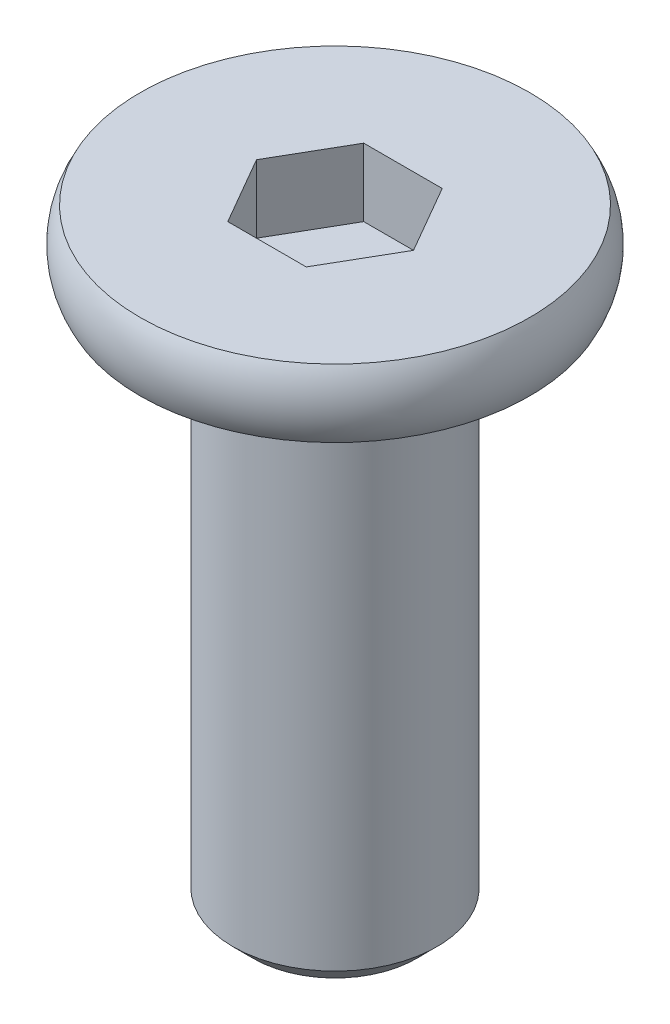
ISO-10303-21;
HEADER;
FILE_DESCRIPTION(('STEP AP214'),'2;1');
FILE_NAME('part.step','',(''),(''),'','','');
FILE_SCHEMA(('AUTOMOTIVE_DESIGN { 1 0 10303 214 1 1 1 1 }'));
ENDSEC;
DATA;
#1=APPLICATION_CONTEXT('core data for automotive mechanical design processes');
#2=APPLICATION_PROTOCOL_DEFINITION('international standard','automotive_design',2000,#1);
#3=PRODUCT_CONTEXT('',#1,'mechanical');
#4=PRODUCT('Part','Part','',(#3));
#5=PRODUCT_RELATED_PRODUCT_CATEGORY('part','',(#4));
#6=PRODUCT_DEFINITION_FORMATION('','',#4);
#7=PRODUCT_DEFINITION_CONTEXT('part definition',#1,'design');
#8=PRODUCT_DEFINITION('design','',#6,#7);
#9=PRODUCT_DEFINITION_SHAPE('','',#8);
#10=(LENGTH_UNIT() NAMED_UNIT(*) SI_UNIT(.MILLI.,.METRE.));
#11=(NAMED_UNIT(*) PLANE_ANGLE_UNIT() SI_UNIT($,.RADIAN.));
#12=(NAMED_UNIT(*) SI_UNIT($,.STERADIAN.) SOLID_ANGLE_UNIT());
#13=UNCERTAINTY_MEASURE_WITH_UNIT(LENGTH_MEASURE(1.E-05),#10,'distance_accuracy_value','');
#14=(GEOMETRIC_REPRESENTATION_CONTEXT(3) GLOBAL_UNCERTAINTY_ASSIGNED_CONTEXT((#13)) GLOBAL_UNIT_ASSIGNED_CONTEXT((#10,
#11,#12)) REPRESENTATION_CONTEXT('',''));
#15=CARTESIAN_POINT('',(0.,0.,0.));
#16=DIRECTION('',(0.,0.,1.));
#17=DIRECTION('',(1.,0.,0.));
#18=AXIS2_PLACEMENT_3D('',#15,#16,#17);
#19=CARTESIAN_POINT('',(1.5,-9.,0.));
#20=DIRECTION('',(0.,1.,0.));
#21=DIRECTION('',(0.,0.,1.));
#22=AXIS2_PLACEMENT_3D('',#19,#20,#21);
#23=PLANE('',#22);
#24=CARTESIAN_POINT('',(0.,-9.,0.));
#25=DIRECTION('',(0.,1.,0.));
#26=DIRECTION('',(0.,0.,1.));
#27=AXIS2_PLACEMENT_3D('',#24,#25,#26);
#28=CIRCLE('',#27,1.2);
#29=CARTESIAN_POINT('',(0.,-9.,1.2));
#30=VERTEX_POINT('',#29);
#31=EDGE_CURVE('E11',#30,#30,#28,.F.);
#32=ORIENTED_EDGE('',*,*,#31,.T.);
#33=EDGE_LOOP('',(#32));
#34=FACE_BOUND('',#33,.T.);
#35=ADVANCED_FACE('F37',(#34),#23,.F.);
#36=CARTESIAN_POINT('',(0.,0.,0.));
#37=DIRECTION('',(0.,1.,0.));
#38=DIRECTION('',(0.,0.,1.));
#39=AXIS2_PLACEMENT_3D('',#36,#37,#38);
#40=CYLINDRICAL_SURFACE('',#39,1.5);
#41=CARTESIAN_POINT('',(0.,-8.7,0.));
#42=DIRECTION('',(0.,1.,0.));
#43=DIRECTION('',(0.,0.,1.));
#44=AXIS2_PLACEMENT_3D('',#41,#42,#43);
#45=CIRCLE('',#44,1.5);
#46=CARTESIAN_POINT('',(0.,-8.7,1.5));
#47=VERTEX_POINT('',#46);
#48=EDGE_CURVE('E45',#47,#47,#45,.T.);
#49=ORIENTED_EDGE('',*,*,#48,.T.);
#50=EDGE_LOOP('',(#49));
#51=FACE_BOUND('',#50,.T.);
#52=CARTESIAN_POINT('',(0.,-1.,0.));
#53=DIRECTION('',(0.,1.,0.));
#54=DIRECTION('',(0.,0.,1.));
#55=AXIS2_PLACEMENT_3D('',#52,#53,#54);
#56=CIRCLE('',#55,1.5);
#57=CARTESIAN_POINT('',(0.,-1.,1.5));
#58=VERTEX_POINT('',#57);
#59=EDGE_CURVE('E150',#58,#58,#56,.T.);
#60=ORIENTED_EDGE('',*,*,#59,.F.);
#61=EDGE_LOOP('',(#60));
#62=FACE_BOUND('',#61,.T.);
#63=ADVANCED_FACE('F155',(#51,#62),#40,.T.);
#64=CARTESIAN_POINT('',(2.86602540378444,-1.,0.));
#65=DIRECTION('',(0.,1.,0.));
#66=DIRECTION('',(0.,0.,1.));
#67=AXIS2_PLACEMENT_3D('',#64,#65,#66);
#68=PLANE('',#67);
#69=CARTESIAN_POINT('',(0.,-1.,0.));
#70=DIRECTION('',(0.,1.,0.));
#71=DIRECTION('',(0.,0.,1.));
#72=AXIS2_PLACEMENT_3D('',#69,#70,#71);
#73=CIRCLE('',#72,2.86602540378444);
#74=CARTESIAN_POINT('',(0.,-1.,2.86602540378444));
#75=VERTEX_POINT('',#74);
#76=EDGE_CURVE('E147',#75,#75,#73,.T.);
#77=ORIENTED_EDGE('',*,*,#76,.F.);
#78=EDGE_LOOP('',(#77));
#79=FACE_BOUND('',#78,.T.);
#80=ORIENTED_EDGE('',*,*,#59,.T.);
#81=EDGE_LOOP('',(#80));
#82=FACE_BOUND('',#81,.T.);
#83=ADVANCED_FACE('F177',(#79,#82),#68,.F.);
#84=CARTESIAN_POINT('',(0.,-0.5,0.));
#85=DIRECTION('',(0.,1.,0.));
#86=DIRECTION('',(0.,0.,1.));
#87=AXIS2_PLACEMENT_3D('',#84,#85,#86);
#88=TOROIDAL_SURFACE('',#87,2.,1.);
#89=CARTESIAN_POINT('',(0.,0.,0.));
#90=DIRECTION('',(0.,1.,0.));
#91=DIRECTION('',(0.,0.,1.));
#92=AXIS2_PLACEMENT_3D('',#89,#90,#91);
#93=CIRCLE('',#92,2.86602540378444);
#94=CARTESIAN_POINT('',(0.,0.,2.86602540378444));
#95=VERTEX_POINT('',#94);
#96=EDGE_CURVE('E139',#95,#95,#93,.T.);
#97=ORIENTED_EDGE('',*,*,#96,.F.);
#98=EDGE_LOOP('',(#97));
#99=FACE_BOUND('',#98,.T.);
#100=ORIENTED_EDGE('',*,*,#76,.T.);
#101=EDGE_LOOP('',(#100));
#102=FACE_BOUND('',#101,.T.);
#103=ADVANCED_FACE('F168',(#99,#102),#88,.T.);
#104=CARTESIAN_POINT('',(0.,0.,0.));
#105=DIRECTION('',(0.,-1.,0.));
#106=DIRECTION('',(0.,0.,-1.));
#107=AXIS2_PLACEMENT_3D('',#104,#105,#106);
#108=PLANE('',#107);
#109=DIRECTION('',(-0.5,0.,-0.866025403784438));
#110=VECTOR('',#109,1.);
#111=CARTESIAN_POINT('',(1.15470053837925,0.,0.));
#112=LINE('',#111,#110);
#113=CARTESIAN_POINT('',(1.15470053837925,0.,0.));
#114=VERTEX_POINT('',#113);
#115=CARTESIAN_POINT('',(0.577350269189626,0.,-1.));
#116=VERTEX_POINT('',#115);
#117=EDGE_CURVE('E126',#114,#116,#112,.T.);
#118=ORIENTED_EDGE('',*,*,#117,.F.);
#119=DIRECTION('',(0.5,0.,-0.866025403784439));
#120=VECTOR('',#119,1.);
#121=CARTESIAN_POINT('',(0.577350269189626,0.,1.));
#122=LINE('',#121,#120);
#123=CARTESIAN_POINT('',(0.577350269189626,0.,1.));
#124=VERTEX_POINT('',#123);
#125=EDGE_CURVE('E52',#124,#114,#122,.T.);
#126=ORIENTED_EDGE('',*,*,#125,.F.);
#127=DIRECTION('',(1.,0.,0.));
#128=VECTOR('',#127,1.);
#129=CARTESIAN_POINT('',(-0.577350269189625,0.,1.));
#130=LINE('',#129,#128);
#131=CARTESIAN_POINT('',(-0.577350269189625,0.,1.));
#132=VERTEX_POINT('',#131);
#133=EDGE_CURVE('E135',#132,#124,#130,.T.);
#134=ORIENTED_EDGE('',*,*,#133,.F.);
#135=DIRECTION('',(0.5,0.,0.866025403784439));
#136=VECTOR('',#135,1.);
#137=CARTESIAN_POINT('',(-1.15470053837925,0.,0.));
#138=LINE('',#137,#136);
#139=CARTESIAN_POINT('',(-1.15470053837925,0.,0.));
#140=VERTEX_POINT('',#139);
#141=EDGE_CURVE('E133',#140,#132,#138,.T.);
#142=ORIENTED_EDGE('',*,*,#141,.F.);
#143=DIRECTION('',(-0.5,0.,0.866025403784438));
#144=VECTOR('',#143,1.);
#145=CARTESIAN_POINT('',(-0.577350269189626,0.,-1.));
#146=LINE('',#145,#144);
#147=CARTESIAN_POINT('',(-0.577350269189626,0.,-1.));
#148=VERTEX_POINT('',#147);
#149=EDGE_CURVE('E100',#148,#140,#146,.T.);
#150=ORIENTED_EDGE('',*,*,#149,.F.);
#151=DIRECTION('',(-1.,0.,0.));
#152=VECTOR('',#151,1.);
#153=CARTESIAN_POINT('',(0.577350269189626,0.,-1.));
#154=LINE('',#153,#152);
#155=EDGE_CURVE('E129',#116,#148,#154,.T.);
#156=ORIENTED_EDGE('',*,*,#155,.F.);
#157=EDGE_LOOP('',(#118,#126,#134,#142,#150,#156));
#158=FACE_BOUND('',#157,.T.);
#159=ORIENTED_EDGE('',*,*,#96,.T.);
#160=EDGE_LOOP('',(#159));
#161=FACE_BOUND('',#160,.T.);
#162=ADVANCED_FACE('F160',(#158,#161),#108,.F.);
#163=CARTESIAN_POINT('',(0.,-8.7,0.));
#164=DIRECTION('',(0.,1.,0.));
#165=DIRECTION('',(0.,0.,1.));
#166=AXIS2_PLACEMENT_3D('',#163,#164,#165);
#167=CONICAL_SURFACE('',#166,1.5,0.785398163397456);
#168=ORIENTED_EDGE('',*,*,#31,.F.);
#169=EDGE_LOOP('',(#168));
#170=FACE_BOUND('',#169,.T.);
#171=ORIENTED_EDGE('',*,*,#48,.F.);
#172=EDGE_LOOP('',(#171));
#173=FACE_BOUND('',#172,.T.);
#174=ADVANCED_FACE('F39',(#170,#173),#167,.T.);
#175=CARTESIAN_POINT('',(0.577350269189626,-1.,1.));
#176=DIRECTION('',(0.866025403784439,0.,0.5));
#177=DIRECTION('',(0.5,0.,-0.866025403784439));
#178=AXIS2_PLACEMENT_3D('',#175,#176,#177);
#179=PLANE('',#178);
#180=ORIENTED_EDGE('',*,*,#125,.T.);
#181=DIRECTION('',(0.,1.,0.));
#182=VECTOR('',#181,1.);
#183=CARTESIAN_POINT('',(1.15470053837925,-1.,0.));
#184=LINE('',#183,#182);
#185=CARTESIAN_POINT('',(1.15470053837925,-1.,0.));
#186=VERTEX_POINT('',#185);
#187=EDGE_CURVE('E82',#186,#114,#184,.T.);
#188=ORIENTED_EDGE('',*,*,#187,.F.);
#189=DIRECTION('',(0.5,0.,-0.866025403784439));
#190=VECTOR('',#189,1.);
#191=CARTESIAN_POINT('',(0.577350269189626,-1.,1.));
#192=LINE('',#191,#190);
#193=CARTESIAN_POINT('',(0.577350269189626,-1.,1.));
#194=VERTEX_POINT('',#193);
#195=EDGE_CURVE('E137',#194,#186,#192,.T.);
#196=ORIENTED_EDGE('',*,*,#195,.F.);
#197=DIRECTION('',(0.,1.,0.));
#198=VECTOR('',#197,1.);
#199=CARTESIAN_POINT('',(0.577350269189626,-1.,1.));
#200=LINE('',#199,#198);
#201=EDGE_CURVE('E60',#194,#124,#200,.T.);
#202=ORIENTED_EDGE('',*,*,#201,.T.);
#203=EDGE_LOOP('',(#180,#188,#196,#202));
#204=FACE_BOUND('',#203,.T.);
#205=ADVANCED_FACE('F159',(#204),#179,.F.);
#206=CARTESIAN_POINT('',(-0.577350269189625,-1.,1.));
#207=DIRECTION('',(0.,0.,1.));
#208=DIRECTION('',(1.,0.,0.));
#209=AXIS2_PLACEMENT_3D('',#206,#207,#208);
#210=PLANE('',#209);
#211=ORIENTED_EDGE('',*,*,#133,.T.);
#212=ORIENTED_EDGE('',*,*,#201,.F.);
#213=DIRECTION('',(1.,0.,0.));
#214=VECTOR('',#213,1.);
#215=CARTESIAN_POINT('',(-0.577350269189625,-1.,1.));
#216=LINE('',#215,#214);
#217=CARTESIAN_POINT('',(-0.577350269189625,-1.,1.));
#218=VERTEX_POINT('',#217);
#219=EDGE_CURVE('E112',#218,#194,#216,.T.);
#220=ORIENTED_EDGE('',*,*,#219,.F.);
#221=DIRECTION('',(0.,1.,0.));
#222=VECTOR('',#221,1.);
#223=CARTESIAN_POINT('',(-0.577350269189625,-1.,1.));
#224=LINE('',#223,#222);
#225=EDGE_CURVE('E104',#218,#132,#224,.T.);
#226=ORIENTED_EDGE('',*,*,#225,.T.);
#227=EDGE_LOOP('',(#211,#212,#220,#226));
#228=FACE_BOUND('',#227,.T.);
#229=ADVANCED_FACE('F166',(#228),#210,.F.);
#230=CARTESIAN_POINT('',(-1.15470053837925,-1.,0.));
#231=DIRECTION('',(-0.866025403784439,0.,0.5));
#232=DIRECTION('',(0.5,0.,0.866025403784439));
#233=AXIS2_PLACEMENT_3D('',#230,#231,#232);
#234=PLANE('',#233);
#235=ORIENTED_EDGE('',*,*,#141,.T.);
#236=ORIENTED_EDGE('',*,*,#225,.F.);
#237=DIRECTION('',(0.5,0.,0.866025403784439));
#238=VECTOR('',#237,1.);
#239=CARTESIAN_POINT('',(-1.15470053837925,-1.,0.));
#240=LINE('',#239,#238);
#241=CARTESIAN_POINT('',(-1.15470053837925,-1.,0.));
#242=VERTEX_POINT('',#241);
#243=EDGE_CURVE('E108',#242,#218,#240,.T.);
#244=ORIENTED_EDGE('',*,*,#243,.F.);
#245=DIRECTION('',(0.,1.,0.));
#246=VECTOR('',#245,1.);
#247=CARTESIAN_POINT('',(-1.15470053837925,-1.,0.));
#248=LINE('',#247,#246);
#249=EDGE_CURVE('E93',#242,#140,#248,.T.);
#250=ORIENTED_EDGE('',*,*,#249,.T.);
#251=EDGE_LOOP('',(#235,#236,#244,#250));
#252=FACE_BOUND('',#251,.T.);
#253=ADVANCED_FACE('F109',(#252),#234,.F.);
#254=CARTESIAN_POINT('',(-0.577350269189626,-1.,-1.));
#255=DIRECTION('',(-0.866025403784439,0.,-0.5));
#256=DIRECTION('',(-0.5,0.,0.866025403784439));
#257=AXIS2_PLACEMENT_3D('',#254,#255,#256);
#258=PLANE('',#257);
#259=ORIENTED_EDGE('',*,*,#149,.T.);
#260=ORIENTED_EDGE('',*,*,#249,.F.);
#261=DIRECTION('',(-0.5,0.,0.866025403784438));
#262=VECTOR('',#261,1.);
#263=CARTESIAN_POINT('',(-0.577350269189626,-1.,-1.));
#264=LINE('',#263,#262);
#265=CARTESIAN_POINT('',(-0.577350269189626,-1.,-1.));
#266=VERTEX_POINT('',#265);
#267=EDGE_CURVE('E97',#266,#242,#264,.T.);
#268=ORIENTED_EDGE('',*,*,#267,.F.);
#269=DIRECTION('',(0.,1.,0.));
#270=VECTOR('',#269,1.);
#271=CARTESIAN_POINT('',(-0.577350269189626,-1.,-1.));
#272=LINE('',#271,#270);
#273=EDGE_CURVE('E105',#266,#148,#272,.T.);
#274=ORIENTED_EDGE('',*,*,#273,.T.);
#275=EDGE_LOOP('',(#259,#260,#268,#274));
#276=FACE_BOUND('',#275,.T.);
#277=ADVANCED_FACE('F95',(#276),#258,.F.);
#278=CARTESIAN_POINT('',(0.577350269189626,-1.,-1.));
#279=DIRECTION('',(0.,0.,-1.));
#280=DIRECTION('',(-1.,0.,0.));
#281=AXIS2_PLACEMENT_3D('',#278,#279,#280);
#282=PLANE('',#281);
#283=ORIENTED_EDGE('',*,*,#155,.T.);
#284=ORIENTED_EDGE('',*,*,#273,.F.);
#285=DIRECTION('',(-1.,0.,0.));
#286=VECTOR('',#285,1.);
#287=CARTESIAN_POINT('',(0.577350269189626,-1.,-1.));
#288=LINE('',#287,#286);
#289=CARTESIAN_POINT('',(0.577350269189626,-1.,-1.));
#290=VERTEX_POINT('',#289);
#291=EDGE_CURVE('E118',#290,#266,#288,.T.);
#292=ORIENTED_EDGE('',*,*,#291,.F.);
#293=DIRECTION('',(0.,1.,0.));
#294=VECTOR('',#293,1.);
#295=CARTESIAN_POINT('',(0.577350269189626,-1.,-1.));
#296=LINE('',#295,#294);
#297=EDGE_CURVE('E142',#290,#116,#296,.T.);
#298=ORIENTED_EDGE('',*,*,#297,.T.);
#299=EDGE_LOOP('',(#283,#284,#292,#298));
#300=FACE_BOUND('',#299,.T.);
#301=ADVANCED_FACE('F189',(#300),#282,.F.);
#302=CARTESIAN_POINT('',(1.15470053837925,-1.,0.));
#303=DIRECTION('',(0.866025403784438,0.,-0.5));
#304=DIRECTION('',(-0.5,0.,-0.866025403784439));
#305=AXIS2_PLACEMENT_3D('',#302,#303,#304);
#306=PLANE('',#305);
#307=ORIENTED_EDGE('',*,*,#117,.T.);
#308=ORIENTED_EDGE('',*,*,#297,.F.);
#309=DIRECTION('',(-0.5,0.,-0.866025403784438));
#310=VECTOR('',#309,1.);
#311=CARTESIAN_POINT('',(1.15470053837925,-1.,0.));
#312=LINE('',#311,#310);
#313=EDGE_CURVE('E120',#186,#290,#312,.T.);
#314=ORIENTED_EDGE('',*,*,#313,.F.);
#315=ORIENTED_EDGE('',*,*,#187,.T.);
#316=EDGE_LOOP('',(#307,#308,#314,#315));
#317=FACE_BOUND('',#316,.T.);
#318=ADVANCED_FACE('F186',(#317),#306,.F.);
#319=CARTESIAN_POINT('',(0.,-1.,0.));
#320=DIRECTION('',(0.,1.,0.));
#321=DIRECTION('',(0.,0.,1.));
#322=AXIS2_PLACEMENT_3D('',#319,#320,#321);
#323=PLANE('',#322);
#324=ORIENTED_EDGE('',*,*,#195,.T.);
#325=ORIENTED_EDGE('',*,*,#313,.T.);
#326=ORIENTED_EDGE('',*,*,#291,.T.);
#327=ORIENTED_EDGE('',*,*,#267,.T.);
#328=ORIENTED_EDGE('',*,*,#243,.T.);
#329=ORIENTED_EDGE('',*,*,#219,.T.);
#330=EDGE_LOOP('',(#324,#325,#326,#327,#328,#329));
#331=FACE_BOUND('',#330,.T.);
#332=ADVANCED_FACE('F115',(#331),#323,.T.);
#333=CLOSED_SHELL('',(#35,#63,#83,#103,#162,#174,#205,#229,#253,#277,#301,#318,#332));
#334=MANIFOLD_SOLID_BREP('B2',#333);
#335=ADVANCED_BREP_SHAPE_REPRESENTATION('',(#18,#334),#14);
#336=SHAPE_DEFINITION_REPRESENTATION(#9,#335);
ENDSEC;
END-ISO-10303-21;
